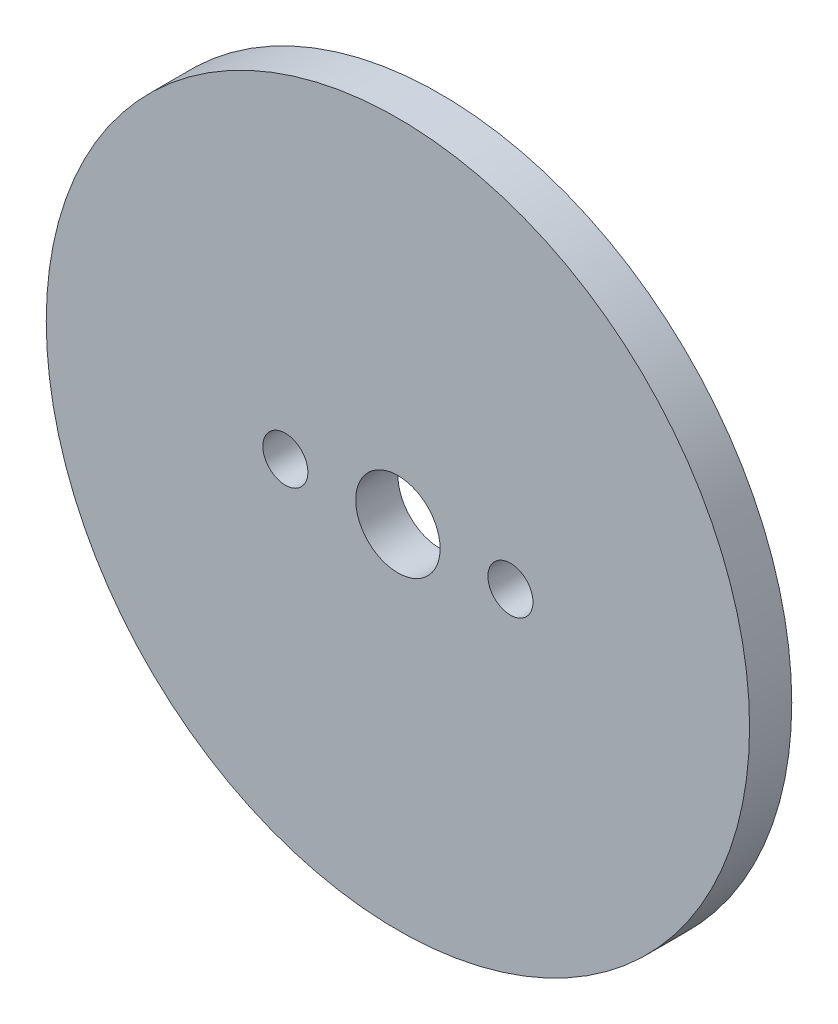
ISO-10303-21;
HEADER;
FILE_DESCRIPTION(('STEP AP214'),'2;1');
FILE_NAME('part.step','',(''),(''),'','','');
FILE_SCHEMA(('AUTOMOTIVE_DESIGN { 1 0 10303 214 1 1 1 1 }'));
ENDSEC;
DATA;
#1=APPLICATION_CONTEXT('core data for automotive mechanical design processes');
#2=APPLICATION_PROTOCOL_DEFINITION('international standard','automotive_design',2000,#1);
#3=PRODUCT_CONTEXT('',#1,'mechanical');
#4=PRODUCT('Part','Part','',(#3));
#5=PRODUCT_RELATED_PRODUCT_CATEGORY('part','',(#4));
#6=PRODUCT_DEFINITION_FORMATION('','',#4);
#7=PRODUCT_DEFINITION_CONTEXT('part definition',#1,'design');
#8=PRODUCT_DEFINITION('design','',#6,#7);
#9=PRODUCT_DEFINITION_SHAPE('','',#8);
#10=(LENGTH_UNIT() NAMED_UNIT(*) SI_UNIT(.MILLI.,.METRE.));
#11=(NAMED_UNIT(*) PLANE_ANGLE_UNIT() SI_UNIT($,.RADIAN.));
#12=(NAMED_UNIT(*) SI_UNIT($,.STERADIAN.) SOLID_ANGLE_UNIT());
#13=UNCERTAINTY_MEASURE_WITH_UNIT(LENGTH_MEASURE(1.E-05),#10,'distance_accuracy_value','');
#14=(GEOMETRIC_REPRESENTATION_CONTEXT(3) GLOBAL_UNCERTAINTY_ASSIGNED_CONTEXT((#13)) GLOBAL_UNIT_ASSIGNED_CONTEXT((#10,
#11,#12)) REPRESENTATION_CONTEXT('',''));
#15=CARTESIAN_POINT('',(0.,0.,0.));
#16=DIRECTION('',(0.,0.,1.));
#17=DIRECTION('',(1.,0.,0.));
#18=AXIS2_PLACEMENT_3D('',#15,#16,#17);
#19=CARTESIAN_POINT('',(0.,0.,1.5));
#20=DIRECTION('',(0.,0.,1.));
#21=DIRECTION('',(1.,0.,0.));
#22=AXIS2_PLACEMENT_3D('',#19,#20,#21);
#23=PLANE('',#22);
#24=CARTESIAN_POINT('',(-8.,0.,1.5));
#25=DIRECTION('',(0.,0.,1.));
#26=DIRECTION('',(1.,0.,0.));
#27=AXIS2_PLACEMENT_3D('',#24,#25,#26);
#28=CIRCLE('',#27,1.6);
#29=CARTESIAN_POINT('',(-6.4,0.,1.5));
#30=VERTEX_POINT('',#29);
#31=EDGE_CURVE('E49',#30,#30,#28,.T.);
#32=ORIENTED_EDGE('',*,*,#31,.F.);
#33=EDGE_LOOP('',(#32));
#34=FACE_BOUND('',#33,.T.);
#35=CARTESIAN_POINT('',(0.,0.,1.5));
#36=DIRECTION('',(0.,0.,1.));
#37=DIRECTION('',(1.,0.,0.));
#38=AXIS2_PLACEMENT_3D('',#35,#36,#37);
#39=CIRCLE('',#38,25.);
#40=CARTESIAN_POINT('',(25.,0.,1.5));
#41=VERTEX_POINT('',#40);
#42=EDGE_CURVE('E10',#41,#41,#39,.T.);
#43=ORIENTED_EDGE('',*,*,#42,.T.);
#44=EDGE_LOOP('',(#43));
#45=FACE_BOUND('',#44,.T.);
#46=CARTESIAN_POINT('',(0.,0.,1.5));
#47=DIRECTION('',(0.,0.,1.));
#48=DIRECTION('',(1.,0.,0.));
#49=AXIS2_PLACEMENT_3D('',#46,#47,#48);
#50=CIRCLE('',#49,3.);
#51=CARTESIAN_POINT('',(3.,0.,1.5));
#52=VERTEX_POINT('',#51);
#53=EDGE_CURVE('E44',#52,#52,#50,.T.);
#54=ORIENTED_EDGE('',*,*,#53,.F.);
#55=EDGE_LOOP('',(#54));
#56=FACE_BOUND('',#55,.T.);
#57=CARTESIAN_POINT('',(8.,0.,1.5));
#58=DIRECTION('',(0.,0.,1.));
#59=DIRECTION('',(1.,0.,0.));
#60=AXIS2_PLACEMENT_3D('',#57,#58,#59);
#61=CIRCLE('',#60,1.6);
#62=CARTESIAN_POINT('',(9.6,0.,1.5));
#63=VERTEX_POINT('',#62);
#64=EDGE_CURVE('E55',#63,#63,#61,.T.);
#65=ORIENTED_EDGE('',*,*,#64,.F.);
#66=EDGE_LOOP('',(#65));
#67=FACE_BOUND('',#66,.T.);
#68=ADVANCED_FACE('F33',(#34,#45,#56,#67),#23,.T.);
#69=CARTESIAN_POINT('',(0.,0.,-1.5));
#70=DIRECTION('',(0.,0.,1.));
#71=DIRECTION('',(1.,0.,0.));
#72=AXIS2_PLACEMENT_3D('',#69,#70,#71);
#73=PLANE('',#72);
#74=CARTESIAN_POINT('',(0.,0.,-1.5));
#75=DIRECTION('',(0.,0.,1.));
#76=DIRECTION('',(1.,0.,0.));
#77=AXIS2_PLACEMENT_3D('',#74,#75,#76);
#78=CIRCLE('',#77,25.);
#79=CARTESIAN_POINT('',(25.,0.,-1.5));
#80=VERTEX_POINT('',#79);
#81=EDGE_CURVE('E37',#80,#80,#78,.T.);
#82=ORIENTED_EDGE('',*,*,#81,.F.);
#83=EDGE_LOOP('',(#82));
#84=FACE_BOUND('',#83,.T.);
#85=CARTESIAN_POINT('',(0.,0.,-1.5));
#86=DIRECTION('',(0.,0.,1.));
#87=DIRECTION('',(1.,0.,0.));
#88=AXIS2_PLACEMENT_3D('',#85,#86,#87);
#89=CIRCLE('',#88,3.);
#90=CARTESIAN_POINT('',(3.,0.,-1.5));
#91=VERTEX_POINT('',#90);
#92=EDGE_CURVE('E46',#91,#91,#89,.T.);
#93=ORIENTED_EDGE('',*,*,#92,.T.);
#94=EDGE_LOOP('',(#93));
#95=FACE_BOUND('',#94,.T.);
#96=CARTESIAN_POINT('',(-8.,0.,-1.5));
#97=DIRECTION('',(0.,0.,1.));
#98=DIRECTION('',(1.,0.,0.));
#99=AXIS2_PLACEMENT_3D('',#96,#97,#98);
#100=CIRCLE('',#99,1.6);
#101=CARTESIAN_POINT('',(-6.4,0.,-1.5));
#102=VERTEX_POINT('',#101);
#103=EDGE_CURVE('E52',#102,#102,#100,.T.);
#104=ORIENTED_EDGE('',*,*,#103,.T.);
#105=EDGE_LOOP('',(#104));
#106=FACE_BOUND('',#105,.T.);
#107=CARTESIAN_POINT('',(8.,0.,-1.5));
#108=DIRECTION('',(0.,0.,1.));
#109=DIRECTION('',(1.,0.,0.));
#110=AXIS2_PLACEMENT_3D('',#107,#108,#109);
#111=CIRCLE('',#110,1.6);
#112=CARTESIAN_POINT('',(9.6,0.,-1.5));
#113=VERTEX_POINT('',#112);
#114=EDGE_CURVE('E58',#113,#113,#111,.T.);
#115=ORIENTED_EDGE('',*,*,#114,.T.);
#116=EDGE_LOOP('',(#115));
#117=FACE_BOUND('',#116,.T.);
#118=ADVANCED_FACE('F68',(#84,#95,#106,#117),#73,.F.);
#119=CARTESIAN_POINT('',(0.,0.,1.5));
#120=DIRECTION('',(0.,0.,-1.));
#121=DIRECTION('',(-1.,0.,0.));
#122=AXIS2_PLACEMENT_3D('',#119,#120,#121);
#123=CYLINDRICAL_SURFACE('',#122,25.);
#124=ORIENTED_EDGE('',*,*,#42,.F.);
#125=EDGE_LOOP('',(#124));
#126=FACE_BOUND('',#125,.T.);
#127=ORIENTED_EDGE('',*,*,#81,.T.);
#128=EDGE_LOOP('',(#127));
#129=FACE_BOUND('',#128,.T.);
#130=ADVANCED_FACE('F35',(#126,#129),#123,.T.);
#131=CARTESIAN_POINT('',(0.,0.,1.5));
#132=DIRECTION('',(0.,0.,-1.));
#133=DIRECTION('',(-1.,0.,0.));
#134=AXIS2_PLACEMENT_3D('',#131,#132,#133);
#135=CYLINDRICAL_SURFACE('',#134,3.);
#136=ORIENTED_EDGE('',*,*,#53,.T.);
#137=EDGE_LOOP('',(#136));
#138=FACE_BOUND('',#137,.T.);
#139=ORIENTED_EDGE('',*,*,#92,.F.);
#140=EDGE_LOOP('',(#139));
#141=FACE_BOUND('',#140,.T.);
#142=ADVANCED_FACE('F77',(#138,#141),#135,.F.);
#143=CARTESIAN_POINT('',(-8.,0.,1.5));
#144=DIRECTION('',(0.,0.,-1.));
#145=DIRECTION('',(-1.,0.,0.));
#146=AXIS2_PLACEMENT_3D('',#143,#144,#145);
#147=CYLINDRICAL_SURFACE('',#146,1.6);
#148=ORIENTED_EDGE('',*,*,#31,.T.);
#149=EDGE_LOOP('',(#148));
#150=FACE_BOUND('',#149,.T.);
#151=ORIENTED_EDGE('',*,*,#103,.F.);
#152=EDGE_LOOP('',(#151));
#153=FACE_BOUND('',#152,.T.);
#154=ADVANCED_FACE('F80',(#150,#153),#147,.F.);
#155=CARTESIAN_POINT('',(8.,0.,1.5));
#156=DIRECTION('',(0.,0.,-1.));
#157=DIRECTION('',(-1.,0.,0.));
#158=AXIS2_PLACEMENT_3D('',#155,#156,#157);
#159=CYLINDRICAL_SURFACE('',#158,1.6);
#160=ORIENTED_EDGE('',*,*,#64,.T.);
#161=EDGE_LOOP('',(#160));
#162=FACE_BOUND('',#161,.T.);
#163=ORIENTED_EDGE('',*,*,#114,.F.);
#164=EDGE_LOOP('',(#163));
#165=FACE_BOUND('',#164,.T.);
#166=ADVANCED_FACE('F64',(#162,#165),#159,.F.);
#167=CLOSED_SHELL('',(#68,#118,#130,#142,#154,#166));
#168=MANIFOLD_SOLID_BREP('B2',#167);
#169=ADVANCED_BREP_SHAPE_REPRESENTATION('',(#18,#168),#14);
#170=SHAPE_DEFINITION_REPRESENTATION(#9,#169);
ENDSEC;
END-ISO-10303-21;
